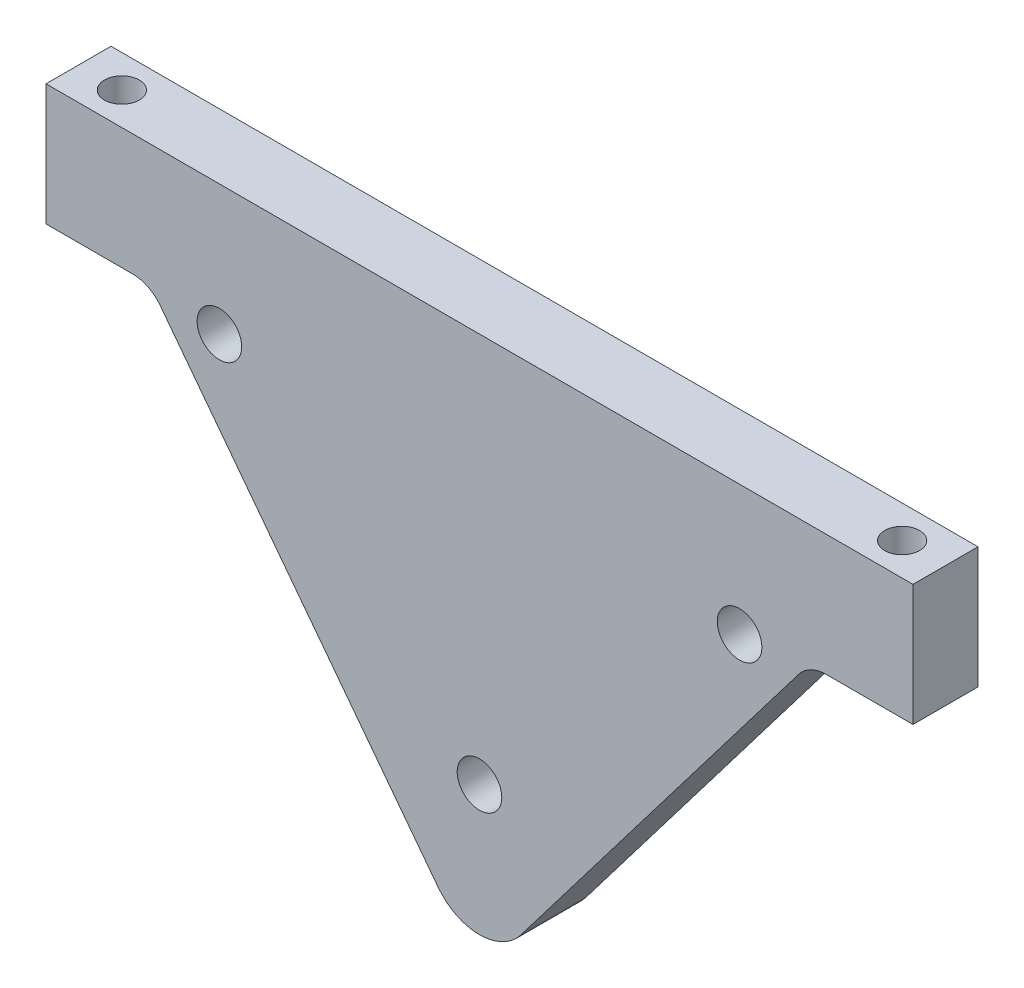
ISO-10303-21;
HEADER;
FILE_DESCRIPTION(('STEP AP214'),'2;1');
FILE_NAME('part.step','',(''),(''),'','','');
FILE_SCHEMA(('AUTOMOTIVE_DESIGN { 1 0 10303 214 1 1 1 1 }'));
ENDSEC;
DATA;
#1=APPLICATION_CONTEXT('core data for automotive mechanical design processes');
#2=APPLICATION_PROTOCOL_DEFINITION('international standard','automotive_design',2000,#1);
#3=PRODUCT_CONTEXT('',#1,'mechanical');
#4=PRODUCT('Part','Part','',(#3));
#5=PRODUCT_RELATED_PRODUCT_CATEGORY('part','',(#4));
#6=PRODUCT_DEFINITION_FORMATION('','',#4);
#7=PRODUCT_DEFINITION_CONTEXT('part definition',#1,'design');
#8=PRODUCT_DEFINITION('design','',#6,#7);
#9=PRODUCT_DEFINITION_SHAPE('','',#8);
#10=(LENGTH_UNIT() NAMED_UNIT(*) SI_UNIT(.MILLI.,.METRE.));
#11=(NAMED_UNIT(*) PLANE_ANGLE_UNIT() SI_UNIT($,.RADIAN.));
#12=(NAMED_UNIT(*) SI_UNIT($,.STERADIAN.) SOLID_ANGLE_UNIT());
#13=UNCERTAINTY_MEASURE_WITH_UNIT(LENGTH_MEASURE(1.E-05),#10,'distance_accuracy_value','');
#14=(GEOMETRIC_REPRESENTATION_CONTEXT(3) GLOBAL_UNCERTAINTY_ASSIGNED_CONTEXT((#13)) GLOBAL_UNIT_ASSIGNED_CONTEXT((#10,
#11,#12)) REPRESENTATION_CONTEXT('',''));
#15=CARTESIAN_POINT('',(0.,0.,0.));
#16=DIRECTION('',(0.,0.,1.));
#17=DIRECTION('',(1.,0.,0.));
#18=AXIS2_PLACEMENT_3D('',#15,#16,#17);
#19=CARTESIAN_POINT('',(-63.5,72.4829514319823,9.525));
#20=DIRECTION('',(1.,0.,0.));
#21=DIRECTION('',(0.,0.,-1.));
#22=AXIS2_PLACEMENT_3D('',#19,#20,#21);
#23=PLANE('',#22);
#24=DIRECTION('',(0.,-1.,0.));
#25=VECTOR('',#24,1.);
#26=CARTESIAN_POINT('',(-63.5,72.4829514319823,0.));
#27=LINE('',#26,#25);
#28=CARTESIAN_POINT('',(-63.5,72.4829514319823,0.));
#29=VERTEX_POINT('',#28);
#30=CARTESIAN_POINT('',(-63.5,54.7029514319823,0.));
#31=VERTEX_POINT('',#30);
#32=EDGE_CURVE('E293',#29,#31,#27,.T.);
#33=ORIENTED_EDGE('',*,*,#32,.T.);
#34=DIRECTION('',(0.,0.,-1.));
#35=VECTOR('',#34,1.);
#36=CARTESIAN_POINT('',(-63.5,54.7029514319823,9.525));
#37=LINE('',#36,#35);
#38=CARTESIAN_POINT('',(-63.5,54.7029514319823,9.525));
#39=VERTEX_POINT('',#38);
#40=EDGE_CURVE('E12',#39,#31,#37,.T.);
#41=ORIENTED_EDGE('',*,*,#40,.F.);
#42=DIRECTION('',(0.,-1.,0.));
#43=VECTOR('',#42,1.);
#44=CARTESIAN_POINT('',(-63.5,72.4829514319823,9.525));
#45=LINE('',#44,#43);
#46=CARTESIAN_POINT('',(-63.5,72.4829514319823,9.525));
#47=VERTEX_POINT('',#46);
#48=EDGE_CURVE('E204',#47,#39,#45,.T.);
#49=ORIENTED_EDGE('',*,*,#48,.F.);
#50=DIRECTION('',(0.,0.,-1.));
#51=VECTOR('',#50,1.);
#52=CARTESIAN_POINT('',(-63.5,72.4829514319823,9.525));
#53=LINE('',#52,#51);
#54=EDGE_CURVE('E169',#47,#29,#53,.T.);
#55=ORIENTED_EDGE('',*,*,#54,.T.);
#56=EDGE_LOOP('',(#33,#41,#49,#55));
#57=FACE_BOUND('',#56,.T.);
#58=ADVANCED_FACE('F60',(#57),#23,.F.);
#59=CARTESIAN_POINT('',(-63.5,54.7029514319823,9.525));
#60=DIRECTION('',(0.,1.,0.));
#61=DIRECTION('',(-1.,0.,0.));
#62=AXIS2_PLACEMENT_3D('',#59,#60,#61);
#63=PLANE('',#62);
#64=CARTESIAN_POINT('',(-57.15,54.7029514319823,4.7625));
#65=DIRECTION('',(0.,1.,0.));
#66=DIRECTION('',(-1.,0.,0.));
#67=AXIS2_PLACEMENT_3D('',#64,#65,#66);
#68=CIRCLE('',#67,2.55269999999999);
#69=CARTESIAN_POINT('',(-59.7027,54.7029514319823,4.7625));
#70=VERTEX_POINT('',#69);
#71=EDGE_CURVE('E244',#70,#70,#68,.T.);
#72=ORIENTED_EDGE('',*,*,#71,.T.);
#73=EDGE_LOOP('',(#72));
#74=FACE_BOUND('',#73,.T.);
#75=DIRECTION('',(1.,0.,0.));
#76=VECTOR('',#75,1.);
#77=CARTESIAN_POINT('',(-63.5,54.7029514319823,0.));
#78=LINE('',#77,#76);
#79=CARTESIAN_POINT('',(-50.8,54.7029514319823,0.));
#80=VERTEX_POINT('',#79);
#81=EDGE_CURVE('E297',#31,#80,#78,.T.);
#82=ORIENTED_EDGE('',*,*,#81,.T.);
#83=DIRECTION('',(0.,0.,-1.));
#84=VECTOR('',#83,1.);
#85=CARTESIAN_POINT('',(-50.8,54.7029514319823,9.525));
#86=LINE('',#85,#84);
#87=CARTESIAN_POINT('',(-50.8,54.7029514319823,9.525));
#88=VERTEX_POINT('',#87);
#89=EDGE_CURVE('E69',#88,#80,#86,.T.);
#90=ORIENTED_EDGE('',*,*,#89,.F.);
#91=DIRECTION('',(1.,0.,0.));
#92=VECTOR('',#91,1.);
#93=CARTESIAN_POINT('',(-63.5,54.7029514319823,9.525));
#94=LINE('',#93,#92);
#95=EDGE_CURVE('E126',#39,#88,#94,.T.);
#96=ORIENTED_EDGE('',*,*,#95,.F.);
#97=ORIENTED_EDGE('',*,*,#40,.T.);
#98=EDGE_LOOP('',(#82,#90,#96,#97));
#99=FACE_BOUND('',#98,.T.);
#100=ADVANCED_FACE('F283',(#74,#99),#63,.F.);
#101=CARTESIAN_POINT('',(-50.8,49.6229514319823,9.525));
#102=DIRECTION('',(0.,0.,-1.));
#103=DIRECTION('',(-1.,0.,0.));
#104=AXIS2_PLACEMENT_3D('',#101,#102,#103);
#105=CYLINDRICAL_SURFACE('',#104,5.07999999999999);
#106=CARTESIAN_POINT('',(-50.8,49.6229514319823,0.));
#107=DIRECTION('',(0.,0.,-1.));
#108=DIRECTION('',(-1.,0.,0.));
#109=AXIS2_PLACEMENT_3D('',#106,#107,#108);
#110=CIRCLE('',#109,5.07999999999999);
#111=CARTESIAN_POINT('',(-46.7591901551607,52.7016290373593,0.));
#112=VERTEX_POINT('',#111);
#113=EDGE_CURVE('E300',#80,#112,#110,.T.);
#114=ORIENTED_EDGE('',*,*,#113,.T.);
#115=DIRECTION('',(0.,0.,-1.));
#116=VECTOR('',#115,1.);
#117=CARTESIAN_POINT('',(-46.7591901551607,52.7016290373593,9.525));
#118=LINE('',#117,#116);
#119=CARTESIAN_POINT('',(-46.7591901551607,52.7016290373593,9.525));
#120=VERTEX_POINT('',#119);
#121=EDGE_CURVE('E342',#120,#112,#118,.T.);
#122=ORIENTED_EDGE('',*,*,#121,.F.);
#123=CARTESIAN_POINT('',(-50.8,49.6229514319823,9.525));
#124=DIRECTION('',(0.,0.,-1.));
#125=DIRECTION('',(-1.,0.,0.));
#126=AXIS2_PLACEMENT_3D('',#123,#124,#125);
#127=CIRCLE('',#126,5.07999999999999);
#128=EDGE_CURVE('E198',#88,#120,#127,.T.);
#129=ORIENTED_EDGE('',*,*,#128,.F.);
#130=ORIENTED_EDGE('',*,*,#89,.T.);
#131=EDGE_LOOP('',(#114,#122,#129,#130));
#132=FACE_BOUND('',#131,.T.);
#133=ADVANCED_FACE('F288',(#132),#105,.F.);
#134=CARTESIAN_POINT('',(-46.7591901551607,52.7016290373593,9.525));
#135=DIRECTION('',(0.795435008826633,0.606038898696259,0.));
#136=DIRECTION('',(-0.606038898696259,0.795435008826633,0.));
#137=AXIS2_PLACEMENT_3D('',#134,#135,#136);
#138=PLANE('',#137);
#139=DIRECTION('',(0.606038898696259,-0.795435008826633,0.));
#140=VECTOR('',#139,1.);
#141=CARTESIAN_POINT('',(-46.7591901551607,52.7016290373593,0.));
#142=LINE('',#141,#140);
#143=CARTESIAN_POINT('',(-6.06121476725895,-0.715064976083238,0.));
#144=VERTEX_POINT('',#143);
#145=EDGE_CURVE('E306',#112,#144,#142,.T.);
#146=ORIENTED_EDGE('',*,*,#145,.T.);
#147=DIRECTION('',(0.,0.,-1.));
#148=VECTOR('',#147,1.);
#149=CARTESIAN_POINT('',(-6.06121476725895,-0.715064976083238,9.525));
#150=LINE('',#149,#148);
#151=CARTESIAN_POINT('',(-6.06121476725895,-0.715064976083238,9.525));
#152=VERTEX_POINT('',#151);
#153=EDGE_CURVE('E338',#152,#144,#150,.T.);
#154=ORIENTED_EDGE('',*,*,#153,.F.);
#155=DIRECTION('',(0.606038898696259,-0.795435008826633,0.));
#156=VECTOR('',#155,1.);
#157=CARTESIAN_POINT('',(-46.7591901551607,52.7016290373593,9.525));
#158=LINE('',#157,#156);
#159=EDGE_CURVE('E190',#120,#152,#158,.T.);
#160=ORIENTED_EDGE('',*,*,#159,.F.);
#161=ORIENTED_EDGE('',*,*,#121,.T.);
#162=EDGE_LOOP('',(#146,#154,#160,#161));
#163=FACE_BOUND('',#162,.T.);
#164=ADVANCED_FACE('F357',(#163),#138,.F.);
#165=CARTESIAN_POINT('',(0.,3.90295143198226,9.525));
#166=DIRECTION('',(0.,0.,-1.));
#167=DIRECTION('',(-1.,0.,0.));
#168=AXIS2_PLACEMENT_3D('',#165,#166,#167);
#169=CYLINDRICAL_SURFACE('',#168,7.62000000000001);
#170=CARTESIAN_POINT('',(0.,3.90295143198226,0.));
#171=DIRECTION('',(0.,0.,1.));
#172=DIRECTION('',(1.,0.,0.));
#173=AXIS2_PLACEMENT_3D('',#170,#171,#172);
#174=CIRCLE('',#173,7.62000000000001);
#175=CARTESIAN_POINT('',(6.06121476725895,-0.71506497608324,0.));
#176=VERTEX_POINT('',#175);
#177=EDGE_CURVE('E309',#144,#176,#174,.T.);
#178=ORIENTED_EDGE('',*,*,#177,.T.);
#179=DIRECTION('',(0.,0.,-1.));
#180=VECTOR('',#179,1.);
#181=CARTESIAN_POINT('',(6.06121476725895,-0.71506497608324,9.525));
#182=LINE('',#181,#180);
#183=CARTESIAN_POINT('',(6.06121476725895,-0.71506497608324,9.525));
#184=VERTEX_POINT('',#183);
#185=EDGE_CURVE('E334',#184,#176,#182,.T.);
#186=ORIENTED_EDGE('',*,*,#185,.F.);
#187=CARTESIAN_POINT('',(0.,3.90295143198226,9.525));
#188=DIRECTION('',(0.,0.,1.));
#189=DIRECTION('',(1.,0.,0.));
#190=AXIS2_PLACEMENT_3D('',#187,#188,#189);
#191=CIRCLE('',#190,7.62000000000001);
#192=EDGE_CURVE('E186',#152,#184,#191,.T.);
#193=ORIENTED_EDGE('',*,*,#192,.F.);
#194=ORIENTED_EDGE('',*,*,#153,.T.);
#195=EDGE_LOOP('',(#178,#186,#193,#194));
#196=FACE_BOUND('',#195,.T.);
#197=ADVANCED_FACE('F361',(#196),#169,.T.);
#198=CARTESIAN_POINT('',(46.7591901551607,52.7016290373593,9.525));
#199=DIRECTION('',(-0.795435008826633,0.606038898696259,0.));
#200=DIRECTION('',(-0.606038898696259,-0.795435008826633,0.));
#201=AXIS2_PLACEMENT_3D('',#198,#199,#200);
#202=PLANE('',#201);
#203=DIRECTION('',(0.606038898696259,0.795435008826633,0.));
#204=VECTOR('',#203,1.);
#205=CARTESIAN_POINT('',(46.7591901551607,52.7016290373593,0.));
#206=LINE('',#205,#204);
#207=CARTESIAN_POINT('',(46.7591901551607,52.7016290373593,0.));
#208=VERTEX_POINT('',#207);
#209=EDGE_CURVE('E312',#176,#208,#206,.T.);
#210=ORIENTED_EDGE('',*,*,#209,.T.);
#211=DIRECTION('',(0.,0.,-1.));
#212=VECTOR('',#211,1.);
#213=CARTESIAN_POINT('',(46.7591901551607,52.7016290373593,9.525));
#214=LINE('',#213,#212);
#215=CARTESIAN_POINT('',(46.7591901551607,52.7016290373593,9.525));
#216=VERTEX_POINT('',#215);
#217=EDGE_CURVE('E330',#216,#208,#214,.T.);
#218=ORIENTED_EDGE('',*,*,#217,.F.);
#219=DIRECTION('',(0.606038898696259,0.795435008826633,0.));
#220=VECTOR('',#219,1.);
#221=CARTESIAN_POINT('',(46.7591901551607,52.7016290373593,9.525));
#222=LINE('',#221,#220);
#223=EDGE_CURVE('E182',#184,#216,#222,.T.);
#224=ORIENTED_EDGE('',*,*,#223,.F.);
#225=ORIENTED_EDGE('',*,*,#185,.T.);
#226=EDGE_LOOP('',(#210,#218,#224,#225));
#227=FACE_BOUND('',#226,.T.);
#228=ADVANCED_FACE('F279',(#227),#202,.F.);
#229=CARTESIAN_POINT('',(50.8,49.6229514319823,9.525));
#230=DIRECTION('',(0.,0.,-1.));
#231=DIRECTION('',(-1.,0.,0.));
#232=AXIS2_PLACEMENT_3D('',#229,#230,#231);
#233=CYLINDRICAL_SURFACE('',#232,5.07999999999999);
#234=CARTESIAN_POINT('',(50.8,49.6229514319823,0.));
#235=DIRECTION('',(0.,0.,-1.));
#236=DIRECTION('',(1.,0.,0.));
#237=AXIS2_PLACEMENT_3D('',#234,#235,#236);
#238=CIRCLE('',#237,5.07999999999999);
#239=CARTESIAN_POINT('',(50.8,54.7029514319823,0.));
#240=VERTEX_POINT('',#239);
#241=EDGE_CURVE('E315',#208,#240,#238,.T.);
#242=ORIENTED_EDGE('',*,*,#241,.T.);
#243=DIRECTION('',(0.,0.,-1.));
#244=VECTOR('',#243,1.);
#245=CARTESIAN_POINT('',(50.8,54.7029514319823,9.525));
#246=LINE('',#245,#244);
#247=CARTESIAN_POINT('',(50.8,54.7029514319823,9.525));
#248=VERTEX_POINT('',#247);
#249=EDGE_CURVE('E162',#248,#240,#246,.T.);
#250=ORIENTED_EDGE('',*,*,#249,.F.);
#251=CARTESIAN_POINT('',(50.8,49.6229514319823,9.525));
#252=DIRECTION('',(0.,0.,-1.));
#253=DIRECTION('',(1.,0.,0.));
#254=AXIS2_PLACEMENT_3D('',#251,#252,#253);
#255=CIRCLE('',#254,5.07999999999999);
#256=EDGE_CURVE('E151',#216,#248,#255,.T.);
#257=ORIENTED_EDGE('',*,*,#256,.F.);
#258=ORIENTED_EDGE('',*,*,#217,.T.);
#259=EDGE_LOOP('',(#242,#250,#257,#258));
#260=FACE_BOUND('',#259,.T.);
#261=ADVANCED_FACE('F270',(#260),#233,.F.);
#262=CARTESIAN_POINT('',(50.8,54.7029514319823,9.525));
#263=DIRECTION('',(0.,1.,0.));
#264=DIRECTION('',(-1.,0.,0.));
#265=AXIS2_PLACEMENT_3D('',#262,#263,#264);
#266=PLANE('',#265);
#267=CARTESIAN_POINT('',(57.15,54.7029514319823,4.7625));
#268=DIRECTION('',(0.,1.,0.));
#269=DIRECTION('',(-1.,0.,0.));
#270=AXIS2_PLACEMENT_3D('',#267,#268,#269);
#271=CIRCLE('',#270,2.55269999999999);
#272=CARTESIAN_POINT('',(54.5973,54.7029514319823,4.7625));
#273=VERTEX_POINT('',#272);
#274=EDGE_CURVE('E236',#273,#273,#271,.T.);
#275=ORIENTED_EDGE('',*,*,#274,.T.);
#276=EDGE_LOOP('',(#275));
#277=FACE_BOUND('',#276,.T.);
#278=DIRECTION('',(1.,0.,0.));
#279=VECTOR('',#278,1.);
#280=CARTESIAN_POINT('',(50.8,54.7029514319823,0.));
#281=LINE('',#280,#279);
#282=CARTESIAN_POINT('',(63.5,54.7029514319823,0.));
#283=VERTEX_POINT('',#282);
#284=EDGE_CURVE('E160',#240,#283,#281,.T.);
#285=ORIENTED_EDGE('',*,*,#284,.T.);
#286=DIRECTION('',(0.,0.,-1.));
#287=VECTOR('',#286,1.);
#288=CARTESIAN_POINT('',(63.5,54.7029514319823,9.525));
#289=LINE('',#288,#287);
#290=CARTESIAN_POINT('',(63.5,54.7029514319823,9.525));
#291=VERTEX_POINT('',#290);
#292=EDGE_CURVE('E157',#291,#283,#289,.T.);
#293=ORIENTED_EDGE('',*,*,#292,.F.);
#294=DIRECTION('',(1.,0.,0.));
#295=VECTOR('',#294,1.);
#296=CARTESIAN_POINT('',(50.8,54.7029514319823,9.525));
#297=LINE('',#296,#295);
#298=EDGE_CURVE('E145',#248,#291,#297,.T.);
#299=ORIENTED_EDGE('',*,*,#298,.F.);
#300=ORIENTED_EDGE('',*,*,#249,.T.);
#301=EDGE_LOOP('',(#285,#293,#299,#300));
#302=FACE_BOUND('',#301,.T.);
#303=ADVANCED_FACE('F158',(#277,#302),#266,.F.);
#304=CARTESIAN_POINT('',(63.5,72.4829514319823,9.525));
#305=DIRECTION('',(-1.,0.,0.));
#306=DIRECTION('',(0.,0.,1.));
#307=AXIS2_PLACEMENT_3D('',#304,#305,#306);
#308=PLANE('',#307);
#309=DIRECTION('',(0.,1.,0.));
#310=VECTOR('',#309,1.);
#311=CARTESIAN_POINT('',(63.5,72.4829514319823,0.));
#312=LINE('',#311,#310);
#313=CARTESIAN_POINT('',(63.5,72.4829514319823,0.));
#314=VERTEX_POINT('',#313);
#315=EDGE_CURVE('E112',#283,#314,#312,.T.);
#316=ORIENTED_EDGE('',*,*,#315,.T.);
#317=DIRECTION('',(0.,0.,-1.));
#318=VECTOR('',#317,1.);
#319=CARTESIAN_POINT('',(63.5,72.4829514319823,9.525));
#320=LINE('',#319,#318);
#321=CARTESIAN_POINT('',(63.5,72.4829514319823,9.525));
#322=VERTEX_POINT('',#321);
#323=EDGE_CURVE('E163',#322,#314,#320,.T.);
#324=ORIENTED_EDGE('',*,*,#323,.F.);
#325=DIRECTION('',(0.,1.,0.));
#326=VECTOR('',#325,1.);
#327=CARTESIAN_POINT('',(63.5,72.4829514319823,9.525));
#328=LINE('',#327,#326);
#329=EDGE_CURVE('E149',#291,#322,#328,.T.);
#330=ORIENTED_EDGE('',*,*,#329,.F.);
#331=ORIENTED_EDGE('',*,*,#292,.T.);
#332=EDGE_LOOP('',(#316,#324,#330,#331));
#333=FACE_BOUND('',#332,.T.);
#334=ADVANCED_FACE('F165',(#333),#308,.F.);
#335=CARTESIAN_POINT('',(-63.5,72.4829514319823,9.525));
#336=DIRECTION('',(0.,-1.,0.));
#337=DIRECTION('',(0.,0.,-1.));
#338=AXIS2_PLACEMENT_3D('',#335,#336,#337);
#339=PLANE('',#338);
#340=CARTESIAN_POINT('',(-57.15,72.4829514319823,4.7625));
#341=DIRECTION('',(0.,1.,0.));
#342=DIRECTION('',(0.,0.,1.));
#343=AXIS2_PLACEMENT_3D('',#340,#341,#342);
#344=CIRCLE('',#343,2.5527);
#345=CARTESIAN_POINT('',(-57.15,72.4829514319823,7.3152));
#346=VERTEX_POINT('',#345);
#347=EDGE_CURVE('E248',#346,#346,#344,.T.);
#348=ORIENTED_EDGE('',*,*,#347,.F.);
#349=EDGE_LOOP('',(#348));
#350=FACE_BOUND('',#349,.T.);
#351=CARTESIAN_POINT('',(57.15,72.4829514319823,4.7625));
#352=DIRECTION('',(0.,1.,0.));
#353=DIRECTION('',(0.,0.,1.));
#354=AXIS2_PLACEMENT_3D('',#351,#352,#353);
#355=CIRCLE('',#354,2.5527);
#356=CARTESIAN_POINT('',(57.15,72.4829514319823,7.3152));
#357=VERTEX_POINT('',#356);
#358=EDGE_CURVE('E240',#357,#357,#355,.T.);
#359=ORIENTED_EDGE('',*,*,#358,.F.);
#360=EDGE_LOOP('',(#359));
#361=FACE_BOUND('',#360,.T.);
#362=DIRECTION('',(-1.,0.,0.));
#363=VECTOR('',#362,1.);
#364=CARTESIAN_POINT('',(-63.5,72.4829514319823,0.));
#365=LINE('',#364,#363);
#366=EDGE_CURVE('E118',#314,#29,#365,.T.);
#367=ORIENTED_EDGE('',*,*,#366,.T.);
#368=ORIENTED_EDGE('',*,*,#54,.F.);
#369=DIRECTION('',(-1.,0.,0.));
#370=VECTOR('',#369,1.);
#371=CARTESIAN_POINT('',(-63.5,72.4829514319823,9.525));
#372=LINE('',#371,#370);
#373=EDGE_CURVE('E77',#322,#47,#372,.T.);
#374=ORIENTED_EDGE('',*,*,#373,.F.);
#375=ORIENTED_EDGE('',*,*,#323,.T.);
#376=EDGE_LOOP('',(#367,#368,#374,#375));
#377=FACE_BOUND('',#376,.T.);
#378=ADVANCED_FACE('F256',(#350,#361,#377),#339,.F.);
#379=CARTESIAN_POINT('',(-50.8,49.6229514319823,9.525));
#380=DIRECTION('',(0.,0.,-1.));
#381=DIRECTION('',(-1.,0.,0.));
#382=AXIS2_PLACEMENT_3D('',#379,#380,#381);
#383=PLANE('',#382);
#384=CARTESIAN_POINT('',(0.,15.3329514319823,9.525));
#385=DIRECTION('',(0.,0.,1.));
#386=DIRECTION('',(1.,0.,0.));
#387=AXIS2_PLACEMENT_3D('',#384,#385,#386);
#388=CIRCLE('',#387,3.26389999999999);
#389=CARTESIAN_POINT('',(3.26389999999999,15.3329514319823,9.525));
#390=VERTEX_POINT('',#389);
#391=EDGE_CURVE('E231',#390,#390,#388,.T.);
#392=ORIENTED_EDGE('',*,*,#391,.F.);
#393=EDGE_LOOP('',(#392));
#394=FACE_BOUND('',#393,.T.);
#395=CARTESIAN_POINT('',(-38.1,53.4329514319823,9.525));
#396=DIRECTION('',(0.,0.,1.));
#397=DIRECTION('',(1.,0.,0.));
#398=AXIS2_PLACEMENT_3D('',#395,#396,#397);
#399=CIRCLE('',#398,3.26389999999999);
#400=CARTESIAN_POINT('',(-34.8361,53.4329514319823,9.525));
#401=VERTEX_POINT('',#400);
#402=EDGE_CURVE('E222',#401,#401,#399,.T.);
#403=ORIENTED_EDGE('',*,*,#402,.F.);
#404=EDGE_LOOP('',(#403));
#405=FACE_BOUND('',#404,.T.);
#406=CARTESIAN_POINT('',(38.1,53.4329514319823,9.525));
#407=DIRECTION('',(0.,0.,1.));
#408=DIRECTION('',(1.,0.,0.));
#409=AXIS2_PLACEMENT_3D('',#406,#407,#408);
#410=CIRCLE('',#409,3.26389999999999);
#411=CARTESIAN_POINT('',(41.3639,53.4329514319823,9.525));
#412=VERTEX_POINT('',#411);
#413=EDGE_CURVE('E214',#412,#412,#410,.T.);
#414=ORIENTED_EDGE('',*,*,#413,.F.);
#415=EDGE_LOOP('',(#414));
#416=FACE_BOUND('',#415,.T.);
#417=ORIENTED_EDGE('',*,*,#48,.T.);
#418=ORIENTED_EDGE('',*,*,#95,.T.);
#419=ORIENTED_EDGE('',*,*,#128,.T.);
#420=ORIENTED_EDGE('',*,*,#159,.T.);
#421=ORIENTED_EDGE('',*,*,#192,.T.);
#422=ORIENTED_EDGE('',*,*,#223,.T.);
#423=ORIENTED_EDGE('',*,*,#256,.T.);
#424=ORIENTED_EDGE('',*,*,#298,.T.);
#425=ORIENTED_EDGE('',*,*,#329,.T.);
#426=ORIENTED_EDGE('',*,*,#373,.T.);
#427=EDGE_LOOP('',(#417,#418,#419,#420,#421,#422,#423,#424,#425,#426));
#428=FACE_BOUND('',#427,.T.);
#429=ADVANCED_FACE('F147',(#394,#405,#416,#428),#383,.F.);
#430=CARTESIAN_POINT('',(-50.8,49.6229514319823,0.));
#431=DIRECTION('',(0.,0.,-1.));
#432=DIRECTION('',(-1.,0.,0.));
#433=AXIS2_PLACEMENT_3D('',#430,#431,#432);
#434=PLANE('',#433);
#435=CARTESIAN_POINT('',(0.,15.3329514319823,0.));
#436=DIRECTION('',(0.,0.,1.));
#437=DIRECTION('',(1.,0.,0.));
#438=AXIS2_PLACEMENT_3D('',#435,#436,#437);
#439=CIRCLE('',#438,3.2639);
#440=CARTESIAN_POINT('',(3.2639,15.3329514319823,0.));
#441=VERTEX_POINT('',#440);
#442=EDGE_CURVE('E227',#441,#441,#439,.T.);
#443=ORIENTED_EDGE('',*,*,#442,.T.);
#444=EDGE_LOOP('',(#443));
#445=FACE_BOUND('',#444,.T.);
#446=CARTESIAN_POINT('',(-38.1,53.4329514319823,0.));
#447=DIRECTION('',(0.,0.,1.));
#448=DIRECTION('',(1.,0.,0.));
#449=AXIS2_PLACEMENT_3D('',#446,#447,#448);
#450=CIRCLE('',#449,3.2639);
#451=CARTESIAN_POINT('',(-34.8361,53.4329514319823,0.));
#452=VERTEX_POINT('',#451);
#453=EDGE_CURVE('E219',#452,#452,#450,.T.);
#454=ORIENTED_EDGE('',*,*,#453,.T.);
#455=EDGE_LOOP('',(#454));
#456=FACE_BOUND('',#455,.T.);
#457=CARTESIAN_POINT('',(38.1,53.4329514319823,0.));
#458=DIRECTION('',(0.,0.,1.));
#459=DIRECTION('',(1.,0.,0.));
#460=AXIS2_PLACEMENT_3D('',#457,#458,#459);
#461=CIRCLE('',#460,3.2639);
#462=CARTESIAN_POINT('',(41.3639,53.4329514319823,0.));
#463=VERTEX_POINT('',#462);
#464=EDGE_CURVE('E208',#463,#463,#461,.T.);
#465=ORIENTED_EDGE('',*,*,#464,.T.);
#466=EDGE_LOOP('',(#465));
#467=FACE_BOUND('',#466,.T.);
#468=ORIENTED_EDGE('',*,*,#32,.F.);
#469=ORIENTED_EDGE('',*,*,#366,.F.);
#470=ORIENTED_EDGE('',*,*,#315,.F.);
#471=ORIENTED_EDGE('',*,*,#284,.F.);
#472=ORIENTED_EDGE('',*,*,#241,.F.);
#473=ORIENTED_EDGE('',*,*,#209,.F.);
#474=ORIENTED_EDGE('',*,*,#177,.F.);
#475=ORIENTED_EDGE('',*,*,#145,.F.);
#476=ORIENTED_EDGE('',*,*,#113,.F.);
#477=ORIENTED_EDGE('',*,*,#81,.F.);
#478=EDGE_LOOP('',(#468,#469,#470,#471,#472,#473,#474,#475,#476,#477));
#479=FACE_BOUND('',#478,.T.);
#480=ADVANCED_FACE('F352',(#445,#456,#467,#479),#434,.T.);
#481=CARTESIAN_POINT('',(38.1,53.4329514319823,9.525));
#482=DIRECTION('',(0.,0.,1.));
#483=DIRECTION('',(1.,0.,0.));
#484=AXIS2_PLACEMENT_3D('',#481,#482,#483);
#485=CYLINDRICAL_SURFACE('',#484,3.26389999999999);
#486=ORIENTED_EDGE('',*,*,#464,.F.);
#487=EDGE_LOOP('',(#486));
#488=FACE_BOUND('',#487,.T.);
#489=ORIENTED_EDGE('',*,*,#413,.T.);
#490=EDGE_LOOP('',(#489));
#491=FACE_BOUND('',#490,.T.);
#492=ADVANCED_FACE('F437',(#488,#491),#485,.F.);
#493=CARTESIAN_POINT('',(-38.1,53.4329514319823,9.525));
#494=DIRECTION('',(0.,0.,1.));
#495=DIRECTION('',(1.,0.,0.));
#496=AXIS2_PLACEMENT_3D('',#493,#494,#495);
#497=CYLINDRICAL_SURFACE('',#496,3.26389999999999);
#498=ORIENTED_EDGE('',*,*,#453,.F.);
#499=EDGE_LOOP('',(#498));
#500=FACE_BOUND('',#499,.T.);
#501=ORIENTED_EDGE('',*,*,#402,.T.);
#502=EDGE_LOOP('',(#501));
#503=FACE_BOUND('',#502,.T.);
#504=ADVANCED_FACE('F447',(#500,#503),#497,.F.);
#505=CARTESIAN_POINT('',(0.,15.3329514319823,9.525));
#506=DIRECTION('',(0.,0.,1.));
#507=DIRECTION('',(1.,0.,0.));
#508=AXIS2_PLACEMENT_3D('',#505,#506,#507);
#509=CYLINDRICAL_SURFACE('',#508,3.26389999999999);
#510=ORIENTED_EDGE('',*,*,#442,.F.);
#511=EDGE_LOOP('',(#510));
#512=FACE_BOUND('',#511,.T.);
#513=ORIENTED_EDGE('',*,*,#391,.T.);
#514=EDGE_LOOP('',(#513));
#515=FACE_BOUND('',#514,.T.);
#516=ADVANCED_FACE('F265',(#512,#515),#509,.F.);
#517=CARTESIAN_POINT('',(57.15,72.4829514319823,4.7625));
#518=DIRECTION('',(0.,1.,0.));
#519=DIRECTION('',(0.,0.,1.));
#520=AXIS2_PLACEMENT_3D('',#517,#518,#519);
#521=CYLINDRICAL_SURFACE('',#520,2.55269999999999);
#522=ORIENTED_EDGE('',*,*,#358,.T.);
#523=EDGE_LOOP('',(#522));
#524=FACE_BOUND('',#523,.T.);
#525=ORIENTED_EDGE('',*,*,#274,.F.);
#526=EDGE_LOOP('',(#525));
#527=FACE_BOUND('',#526,.T.);
#528=ADVANCED_FACE('F262',(#524,#527),#521,.F.);
#529=CARTESIAN_POINT('',(-57.15,72.4829514319823,4.7625));
#530=DIRECTION('',(0.,1.,0.));
#531=DIRECTION('',(0.,0.,1.));
#532=AXIS2_PLACEMENT_3D('',#529,#530,#531);
#533=CYLINDRICAL_SURFACE('',#532,2.55269999999999);
#534=ORIENTED_EDGE('',*,*,#347,.T.);
#535=EDGE_LOOP('',(#534));
#536=FACE_BOUND('',#535,.T.);
#537=ORIENTED_EDGE('',*,*,#71,.F.);
#538=EDGE_LOOP('',(#537));
#539=FACE_BOUND('',#538,.T.);
#540=ADVANCED_FACE('F253',(#536,#539),#533,.F.);
#541=CLOSED_SHELL('',(#58,#100,#133,#164,#197,#228,#261,#303,#334,#378,#429,#480,#492,#504,#516,
#528,#540));
#542=MANIFOLD_SOLID_BREP('B2',#541);
#543=ADVANCED_BREP_SHAPE_REPRESENTATION('',(#18,#542),#14);
#544=SHAPE_DEFINITION_REPRESENTATION(#9,#543);
ENDSEC;
END-ISO-10303-21;
